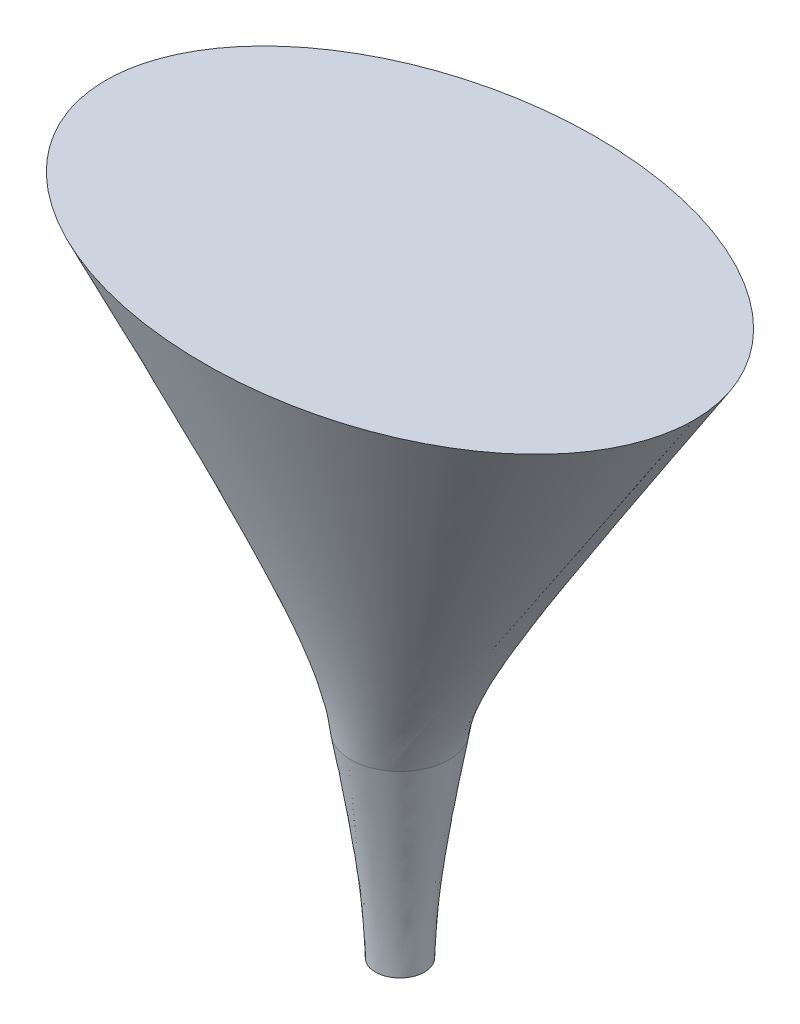
ISO-10303-21;
HEADER;
FILE_DESCRIPTION(('STEP AP214'),'2;1');
FILE_NAME('part.step','',(''),(''),'','','');
FILE_SCHEMA(('AUTOMOTIVE_DESIGN { 1 0 10303 214 1 1 1 1 }'));
ENDSEC;
DATA;
#1=APPLICATION_CONTEXT('core data for automotive mechanical design processes');
#2=APPLICATION_PROTOCOL_DEFINITION('international standard','automotive_design',2000,#1);
#3=PRODUCT_CONTEXT('',#1,'mechanical');
#4=PRODUCT('Part','Part','',(#3));
#5=PRODUCT_RELATED_PRODUCT_CATEGORY('part','',(#4));
#6=PRODUCT_DEFINITION_FORMATION('','',#4);
#7=PRODUCT_DEFINITION_CONTEXT('part definition',#1,'design');
#8=PRODUCT_DEFINITION('design','',#6,#7);
#9=PRODUCT_DEFINITION_SHAPE('','',#8);
#10=(LENGTH_UNIT() NAMED_UNIT(*) SI_UNIT(.MILLI.,.METRE.));
#11=(NAMED_UNIT(*) PLANE_ANGLE_UNIT() SI_UNIT($,.RADIAN.));
#12=(NAMED_UNIT(*) SI_UNIT($,.STERADIAN.) SOLID_ANGLE_UNIT());
#13=UNCERTAINTY_MEASURE_WITH_UNIT(LENGTH_MEASURE(1.E-05),#10,'distance_accuracy_value','');
#14=(GEOMETRIC_REPRESENTATION_CONTEXT(3) GLOBAL_UNCERTAINTY_ASSIGNED_CONTEXT((#13)) GLOBAL_UNIT_ASSIGNED_CONTEXT((#10,
#11,#12)) REPRESENTATION_CONTEXT('',''));
#15=CARTESIAN_POINT('',(0.,0.,0.));
#16=DIRECTION('',(0.,0.,1.));
#17=DIRECTION('',(1.,0.,0.));
#18=AXIS2_PLACEMENT_3D('',#15,#16,#17);
#19=CARTESIAN_POINT('',(0.,125.,0.));
#20=DIRECTION('',(0.,1.,0.));
#21=DIRECTION('',(0.,0.,1.));
#22=AXIS2_PLACEMENT_3D('',#19,#20,#21);
#23=PLANE('',#22);
#24=CARTESIAN_POINT('',(0.,125.,0.));
#25=DIRECTION('',(0.,1.,0.));
#26=DIRECTION('',(1.,0.,0.));
#27=AXIS2_PLACEMENT_3D('',#24,#25,#26);
#28=ELLIPSE('',#27,60.,40.);
#29=CARTESIAN_POINT('',(60.,125.,0.));
#30=VERTEX_POINT('',#29);
#31=EDGE_CURVE('E11',#30,#30,#28,.T.);
#32=ORIENTED_EDGE('',*,*,#31,.T.);
#33=EDGE_LOOP('',(#32));
#34=FACE_BOUND('',#33,.T.);
#35=ADVANCED_FACE('F52',(#34),#23,.T.);
#36=CARTESIAN_POINT('',(-0.651336350521851,40.,-9.97876550273073));
#37=CARTESIAN_POINT('',(-52.2610551427019,125.,-19.6500733995968));
#38=CARTESIAN_POINT('',(-20.6088673559833,40.,-8.67609280168703));
#39=CARTESIAN_POINT('',(-111.211275341492,125.,50.0313334573392));
#40=CARTESIAN_POINT('',(-19.3061946549396,40.,11.2814382037744));
#41=CARTESIAN_POINT('',(-6.68916505608837,125.,89.3314802565327));
#42=CARTESIAN_POINT('',(0.651336350521857,40.,9.97876550273073));
#43=CARTESIAN_POINT('',(52.2610551427019,125.,19.6500733995968));
#44=CARTESIAN_POINT('',(20.6088673559833,40.,8.67609280168702));
#45=CARTESIAN_POINT('',(111.211275341492,125.,-50.0313334573391));
#46=CARTESIAN_POINT('',(19.3061946549396,40.,-11.2814382037744));
#47=CARTESIAN_POINT('',(6.68916505608835,125.,-89.3314802565327));
#48=CARTESIAN_POINT('',(-0.651336350521851,40.,-9.97876550273073));
#49=CARTESIAN_POINT('',(-52.2610551427019,125.,-19.6500733995968));
#50=(BOUNDED_SURFACE() B_SPLINE_SURFACE(3,1,((#36,#37),(#38,#39),(#40,#41),(#42,#43),(#44,#45),
(#46,#47),(#48,#49)),.UNSPECIFIED.,.T.,.F.,.F.) B_SPLINE_SURFACE_WITH_KNOTS((4,3,4),(2,2),(0.,
0.5,1.),(0.,1.),.UNSPECIFIED.) GEOMETRIC_REPRESENTATION_ITEM() RATIONAL_B_SPLINE_SURFACE(((1.,
1.),(0.333333333333333,0.333333333333333),(0.333333333333333,0.333333333333333),(1.,1.),
(0.333333333333333,0.333333333333333),(0.333333333333333,0.333333333333333),(1.,1.))) REPRESENTATION_ITEM('') SURFACE());
#51=CARTESIAN_POINT('',(0.,40.,0.));
#52=DIRECTION('',(0.,1.,0.));
#53=DIRECTION('',(0.,0.,1.));
#54=AXIS2_PLACEMENT_3D('',#51,#52,#53);
#55=CIRCLE('',#54,10.);
#56=CARTESIAN_POINT('',(-0.464788204339128,40.,9.98919275642968));
#57=VERTEX_POINT('',#56);
#58=EDGE_CURVE('E67',#57,#57,#55,.T.);
#59=ORIENTED_EDGE('',*,*,#58,.T.);
#60=EDGE_LOOP('',(#59));
#61=FACE_BOUND('',#60,.T.);
#62=ORIENTED_EDGE('',*,*,#31,.F.);
#63=EDGE_LOOP('',(#62));
#64=FACE_BOUND('',#63,.T.);
#65=ADVANCED_FACE('F82',(#61,#64),#50,.T.);
#66=CARTESIAN_POINT('',(0.,0.,0.));
#67=DIRECTION('',(0.,1.,0.));
#68=DIRECTION('',(0.,0.,1.));
#69=AXIS2_PLACEMENT_3D('',#66,#67,#68);
#70=PLANE('',#69);
#71=CARTESIAN_POINT('',(0.,0.,0.));
#72=DIRECTION('',(0.,1.,0.));
#73=DIRECTION('',(0.,0.,1.));
#74=AXIS2_PLACEMENT_3D('',#71,#72,#73);
#75=CIRCLE('',#74,5.);
#76=CARTESIAN_POINT('',(-4.21717314425251,0.,2.68615909271871));
#77=VERTEX_POINT('',#76);
#78=EDGE_CURVE('E61',#77,#77,#75,.T.);
#79=ORIENTED_EDGE('',*,*,#78,.F.);
#80=EDGE_LOOP('',(#79));
#81=FACE_BOUND('',#80,.T.);
#82=ADVANCED_FACE('F93',(#81),#70,.F.);
#83=CARTESIAN_POINT('',(-0.464788204339128,40.,9.98919275642968));
#84=CARTESIAN_POINT('',(-4.21717314425251,0.,2.68615909271871));
#85=CARTESIAN_POINT('',(-20.4431737171985,40.,9.05961634775143));
#86=CARTESIAN_POINT('',(-9.58949132968992,0.,-5.74818719578632));
#87=CARTESIAN_POINT('',(-19.5135973085202,40.,-10.9187691651079));
#88=CARTESIAN_POINT('',(-1.1551450411849,0.,-11.1205053812237));
#89=CARTESIAN_POINT('',(0.464788204339127,40.,-9.98919275642968));
#90=CARTESIAN_POINT('',(4.21717314425251,0.,-2.68615909271871));
#91=CARTESIAN_POINT('',(20.4431737171985,40.,-9.05961634775143));
#92=CARTESIAN_POINT('',(9.58949132968993,0.,5.74818719578632));
#93=CARTESIAN_POINT('',(19.5135973085202,40.,10.9187691651079));
#94=CARTESIAN_POINT('',(1.1551450411849,0.,11.1205053812237));
#95=CARTESIAN_POINT('',(-0.464788204339128,40.,9.98919275642968));
#96=CARTESIAN_POINT('',(-4.21717314425251,0.,2.68615909271871));
#97=(BOUNDED_SURFACE() B_SPLINE_SURFACE(3,1,((#83,#84),(#85,#86),(#87,#88),(#89,#90),(#91,#92),
(#93,#94),(#95,#96)),.UNSPECIFIED.,.T.,.F.,.F.) B_SPLINE_SURFACE_WITH_KNOTS((4,3,4),(2,2),(0.,
0.5,1.),(0.,1.),.UNSPECIFIED.) GEOMETRIC_REPRESENTATION_ITEM() RATIONAL_B_SPLINE_SURFACE(((1.,
1.),(0.333333333333333,0.333333333333333),(0.333333333333333,0.333333333333333),(1.,1.),
(0.333333333333333,0.333333333333333),(0.333333333333333,0.333333333333333),(1.,1.))) REPRESENTATION_ITEM('') SURFACE());
#98=CARTESIAN_POINT('',(-0.464788204339128,40.,9.98919275642968));
#99=CARTESIAN_POINT('',(-0.503875547463226,39.5833333333333,9.91311948909936));
#100=CARTESIAN_POINT('',(-0.542962890587323,39.1666666666667,9.83704622176904));
#101=CARTESIAN_POINT('',(-0.621137576835519,38.3333333333333,9.68489968710839));
#102=CARTESIAN_POINT('',(-0.660224919959617,37.9166666666667,9.60882641977807));
#103=CARTESIAN_POINT('',(-0.738399606207812,37.0833333333333,9.45667988511742));
#104=CARTESIAN_POINT('',(-0.77748694933191,36.6666666666667,9.3806066177871));
#105=CARTESIAN_POINT('',(-0.855661635580105,35.8333333333333,9.22846008312646));
#106=CARTESIAN_POINT('',(-0.894748978704203,35.4166666666667,9.15238681579613));
#107=CARTESIAN_POINT('',(-0.972923664952399,34.5833333333333,9.00024028113549));
#108=CARTESIAN_POINT('',(-1.0120110080765,34.1666666666667,8.92416701380517));
#109=CARTESIAN_POINT('',(-1.09018569432469,33.3333333333333,8.77202047914452));
#110=CARTESIAN_POINT('',(-1.12927303744879,32.9166666666667,8.69594721181419));
#111=CARTESIAN_POINT('',(-1.20744772369699,32.0833333333333,8.54380067715355));
#112=CARTESIAN_POINT('',(-1.24653506682108,31.6666666666667,8.46772740982323));
#113=CARTESIAN_POINT('',(-1.32470975306928,30.8333333333333,8.31558087516258));
#114=CARTESIAN_POINT('',(-1.36379709619338,30.4166666666667,8.23950760783226));
#115=CARTESIAN_POINT('',(-1.44197178244157,29.5833333333333,8.08736107317162));
#116=CARTESIAN_POINT('',(-1.48105912556567,29.1666666666667,8.01128780584129));
#117=CARTESIAN_POINT('',(-1.55923381181386,28.3333333333333,7.85914127118065));
#118=CARTESIAN_POINT('',(-1.59832115493796,27.9166666666667,7.78306800385032));
#119=CARTESIAN_POINT('',(-1.67649584118616,27.0833333333333,7.63092146918968));
#120=CARTESIAN_POINT('',(-1.71558318431026,26.6666666666667,7.55484820185936));
#121=CARTESIAN_POINT('',(-1.79375787055845,25.8333333333333,7.40270166719871));
#122=CARTESIAN_POINT('',(-1.83284521368255,25.4166666666667,7.32662839986839));
#123=CARTESIAN_POINT('',(-1.91101989993074,24.5833333333333,7.17448186520774));
#124=CARTESIAN_POINT('',(-1.95010724305484,24.1666666666667,7.09840859787742));
#125=CARTESIAN_POINT('',(-2.02828192930304,23.3333333333333,6.94626206321678));
#126=CARTESIAN_POINT('',(-2.06736927242714,22.9166666666667,6.87018879588645));
#127=CARTESIAN_POINT('',(-2.14554395867533,22.0833333333333,6.71804226122581));
#128=CARTESIAN_POINT('',(-2.18463130179943,21.6666666666667,6.64196899389548));
#129=CARTESIAN_POINT('',(-2.26280598804762,20.8333333333333,6.48982245923484));
#130=CARTESIAN_POINT('',(-2.30189333117172,20.4166666666667,6.41374919190452));
#131=CARTESIAN_POINT('',(-2.38006801741992,19.5833333333333,6.26160265724387));
#132=CARTESIAN_POINT('',(-2.41915536054402,19.1666666666667,6.18552938991355));
#133=CARTESIAN_POINT('',(-2.49733004679221,18.3333333333333,6.0333828552529));
#134=CARTESIAN_POINT('',(-2.53641738991631,17.9166666666667,5.95730958792258));
#135=CARTESIAN_POINT('',(-2.6145920761645,17.0833333333333,5.80516305326194));
#136=CARTESIAN_POINT('',(-2.6536794192886,16.6666666666667,5.72908978593161));
#137=CARTESIAN_POINT('',(-2.7318541055368,15.8333333333333,5.57694325127097));
#138=CARTESIAN_POINT('',(-2.7709414486609,15.4166666666667,5.50086998394065));
#139=CARTESIAN_POINT('',(-2.84911613490909,14.5833333333333,5.34872344928));
#140=CARTESIAN_POINT('',(-2.88820347803319,14.1666666666667,5.27265018194968));
#141=CARTESIAN_POINT('',(-2.96637816428138,13.3333333333333,5.12050364728903));
#142=CARTESIAN_POINT('',(-3.00546550740548,12.9166666666667,5.04443037995871));
#143=CARTESIAN_POINT('',(-3.08364019365368,12.0833333333333,4.89228384529806));
#144=CARTESIAN_POINT('',(-3.12272753677777,11.6666666666667,4.81621057796774));
#145=CARTESIAN_POINT('',(-3.20090222302597,10.8333333333333,4.6640640433071));
#146=CARTESIAN_POINT('',(-3.23998956615007,10.4166666666667,4.58799077597677));
#147=CARTESIAN_POINT('',(-3.31816425239826,9.58333333333333,4.43584424131613));
#148=CARTESIAN_POINT('',(-3.35725159552236,9.16666666666667,4.3597709739858));
#149=CARTESIAN_POINT('',(-3.43542628177056,8.33333333333333,4.20762443932516));
#150=CARTESIAN_POINT('',(-3.47451362489465,7.91666666666667,4.13155117199484));
#151=CARTESIAN_POINT('',(-3.55268831114285,7.08333333333333,3.97940463733419));
#152=CARTESIAN_POINT('',(-3.59177565426695,6.66666666666667,3.90333137000387));
#153=CARTESIAN_POINT('',(-3.66995034051514,5.83333333333333,3.75118483534322));
#154=CARTESIAN_POINT('',(-3.70903768363924,5.41666666666667,3.6751115680129));
#155=CARTESIAN_POINT('',(-3.78721236988744,4.58333333333333,3.52296503335226));
#156=CARTESIAN_POINT('',(-3.82629971301153,4.16666666666667,3.44689176602193));
#157=CARTESIAN_POINT('',(-3.90447439925973,3.33333333333333,3.29474523136129));
#158=CARTESIAN_POINT('',(-3.94356174238383,2.91666666666667,3.21867196403096));
#159=CARTESIAN_POINT('',(-4.02173642863202,2.08333333333333,3.06652542937032));
#160=CARTESIAN_POINT('',(-4.06082377175612,1.66666666666667,2.99045216204));
#161=CARTESIAN_POINT('',(-4.13899845800432,0.833333333333333,2.83830562737935));
#162=CARTESIAN_POINT('',(-4.17808580112841,0.416666666666666,2.76223236004903));
#163=CARTESIAN_POINT('',(-4.21717314425251,0.,2.68615909271871));
#164=B_SPLINE_CURVE_WITH_KNOTS('',3,(#98,#99,#100,#101,#102,#103,#104,#105,#106,#107,#108,#109,
#110,#111,#112,#113,#114,#115,#116,#117,#118,#119,#120,#121,#122,#123,#124,#125,#126,#127,#128,
#129,#130,#131,#132,#133,#134,#135,#136,#137,#138,#139,#140,#141,#142,#143,#144,#145,#146,#147,
#148,#149,#150,#151,#152,#153,#154,#155,#156,#157,#158,#159,#160,#161,#162,#163),.UNSPECIFIED.,
.F.,.F.,(4,2,2,2,2,2,2,2,2,2,2,2,2,2,2,2,2,2,2,2,2,2,2,2,2,2,2,2,2,2,2,2,4),(0.,
1.27606216994052,2.55212433988104,3.82818650982156,5.10424867976207,6.38031084970259,
7.65637301964311,8.93243518958363,10.2084973595242,11.4845595294647,12.7606216994052,
14.0366838693457,15.3127460392862,16.5888082092267,17.8648703791673,19.1409325491078,
20.4169947190483,21.6930568889888,22.9691190589293,24.2451812288699,25.5212433988104,
26.7973055687509,28.0733677386914,29.3494299086319,30.6254920785725,31.901554248513,
33.1776164184535,34.453678588394,35.7297407583345,37.0058029282751,38.2818650982156,
39.5579272681561,40.8339894380966),.UNSPECIFIED.);
#165=EDGE_CURVE('BSEAM103',#57,#77,#164,.T.);
#166=ORIENTED_EDGE('',*,*,#58,.F.);
#167=ORIENTED_EDGE('',*,*,#78,.T.);
#168=ORIENTED_EDGE('',*,*,#165,.T.);
#169=ORIENTED_EDGE('',*,*,#165,.F.);
#170=EDGE_LOOP('',(#166,#168,#167,#169));
#171=FACE_BOUND('',#170,.T.);
#172=ADVANCED_FACE('F103',(#171),#97,.T.);
#173=CLOSED_SHELL('',(#35,#65,#82,#172));
#174=MANIFOLD_SOLID_BREP('B2',#173);
#175=ADVANCED_BREP_SHAPE_REPRESENTATION('',(#18,#174),#14);
#176=SHAPE_DEFINITION_REPRESENTATION(#9,#175);
ENDSEC;
END-ISO-10303-21;
